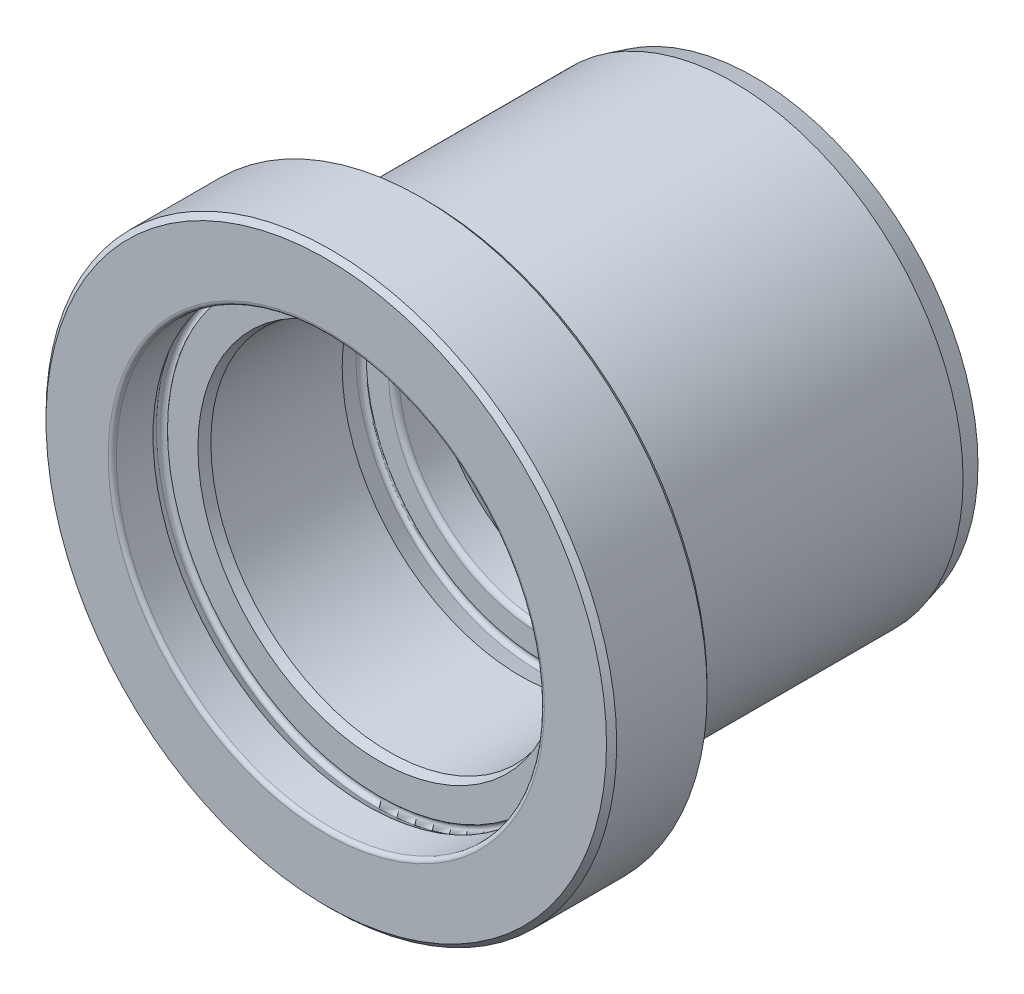
ISO-10303-21;
HEADER;
FILE_DESCRIPTION(('STEP AP214'),'2;1');
FILE_NAME('part.step','',(''),(''),'','','');
FILE_SCHEMA(('AUTOMOTIVE_DESIGN { 1 0 10303 214 1 1 1 1 }'));
ENDSEC;
DATA;
#1=APPLICATION_CONTEXT('core data for automotive mechanical design processes');
#2=APPLICATION_PROTOCOL_DEFINITION('international standard','automotive_design',2000,#1);
#3=PRODUCT_CONTEXT('',#1,'mechanical');
#4=PRODUCT('Part','Part','',(#3));
#5=PRODUCT_RELATED_PRODUCT_CATEGORY('part','',(#4));
#6=PRODUCT_DEFINITION_FORMATION('','',#4);
#7=PRODUCT_DEFINITION_CONTEXT('part definition',#1,'design');
#8=PRODUCT_DEFINITION('design','',#6,#7);
#9=PRODUCT_DEFINITION_SHAPE('','',#8);
#10=(LENGTH_UNIT() NAMED_UNIT(*) SI_UNIT(.MILLI.,.METRE.));
#11=(NAMED_UNIT(*) PLANE_ANGLE_UNIT() SI_UNIT($,.RADIAN.));
#12=(NAMED_UNIT(*) SI_UNIT($,.STERADIAN.) SOLID_ANGLE_UNIT());
#13=UNCERTAINTY_MEASURE_WITH_UNIT(LENGTH_MEASURE(1.E-05),#10,'distance_accuracy_value','');
#14=(GEOMETRIC_REPRESENTATION_CONTEXT(3) GLOBAL_UNCERTAINTY_ASSIGNED_CONTEXT((#13)) GLOBAL_UNIT_ASSIGNED_CONTEXT((#10,
#11,#12)) REPRESENTATION_CONTEXT('',''));
#15=CARTESIAN_POINT('',(0.,0.,0.));
#16=DIRECTION('',(0.,0.,1.));
#17=DIRECTION('',(1.,0.,0.));
#18=AXIS2_PLACEMENT_3D('',#15,#16,#17);
#19=CARTESIAN_POINT('',(0.,0.,-4.));
#20=DIRECTION('',(0.,0.,-1.));
#21=DIRECTION('',(-1.,0.,0.));
#22=AXIS2_PLACEMENT_3D('',#19,#20,#21);
#23=CONICAL_SURFACE('',#22,21.0025,0.520172419876566);
#24=CARTESIAN_POINT('',(0.,0.,-4.77618809610678));
#25=DIRECTION('',(0.,0.,1.));
#26=DIRECTION('',(1.,0.,0.));
#27=AXIS2_PLACEMENT_3D('',#24,#25,#26);
#28=CIRCLE('',#27,21.4470933979066);
#29=CARTESIAN_POINT('',(21.4470933979066,0.,-4.77618809610678));
#30=VERTEX_POINT('',#29);
#31=EDGE_CURVE('E133',#30,#30,#28,.T.);
#32=ORIENTED_EDGE('',*,*,#31,.F.);
#33=EDGE_LOOP('',(#32));
#34=FACE_BOUND('',#33,.T.);
#35=CARTESIAN_POINT('',(0.,0.,-4.));
#36=DIRECTION('',(0.,0.,1.));
#37=DIRECTION('',(1.,0.,0.));
#38=AXIS2_PLACEMENT_3D('',#35,#36,#37);
#39=CIRCLE('',#38,21.0025);
#40=CARTESIAN_POINT('',(21.0025,0.,-4.));
#41=VERTEX_POINT('',#40);
#42=EDGE_CURVE('E10',#41,#41,#39,.T.);
#43=ORIENTED_EDGE('',*,*,#42,.T.);
#44=EDGE_LOOP('',(#43));
#45=FACE_BOUND('',#44,.T.);
#46=ADVANCED_FACE('F39',(#34,#45),#23,.F.);
#47=CARTESIAN_POINT('',(0.,0.,0.));
#48=DIRECTION('',(0.,0.,1.));
#49=DIRECTION('',(1.,0.,0.));
#50=AXIS2_PLACEMENT_3D('',#47,#48,#49);
#51=CYLINDRICAL_SURFACE('',#50,21.0025);
#52=ORIENTED_EDGE('',*,*,#42,.F.);
#53=EDGE_LOOP('',(#52));
#54=FACE_BOUND('',#53,.T.);
#55=CARTESIAN_POINT('',(0.,0.,-0.400000000000004));
#56=DIRECTION('',(0.,0.,1.));
#57=DIRECTION('',(1.,0.,0.));
#58=AXIS2_PLACEMENT_3D('',#55,#56,#57);
#59=CIRCLE('',#58,21.0025);
#60=CARTESIAN_POINT('',(21.0025,0.,-0.400000000000004));
#61=VERTEX_POINT('',#60);
#62=EDGE_CURVE('E45',#61,#61,#59,.T.);
#63=ORIENTED_EDGE('',*,*,#62,.T.);
#64=EDGE_LOOP('',(#63));
#65=FACE_BOUND('',#64,.T.);
#66=ADVANCED_FACE('F140',(#54,#65),#51,.F.);
#67=CARTESIAN_POINT('',(0.,0.,-0.400000000000001));
#68=DIRECTION('',(0.,0.,1.));
#69=DIRECTION('',(1.,0.,0.));
#70=AXIS2_PLACEMENT_3D('',#67,#68,#69);
#71=TOROIDAL_SURFACE('',#70,21.4025,0.400000000000001);
#72=ORIENTED_EDGE('',*,*,#62,.F.);
#73=EDGE_LOOP('',(#72));
#74=FACE_BOUND('',#73,.T.);
#75=CARTESIAN_POINT('',(0.,0.,0.));
#76=DIRECTION('',(0.,0.,1.));
#77=DIRECTION('',(1.,0.,0.));
#78=AXIS2_PLACEMENT_3D('',#75,#76,#77);
#79=CIRCLE('',#78,21.4025);
#80=CARTESIAN_POINT('',(21.4025,0.,0.));
#81=VERTEX_POINT('',#80);
#82=EDGE_CURVE('E49',#81,#81,#79,.T.);
#83=ORIENTED_EDGE('',*,*,#82,.T.);
#84=EDGE_LOOP('',(#83));
#85=FACE_BOUND('',#84,.T.);
#86=ADVANCED_FACE('F144',(#74,#85),#71,.T.);
#87=CARTESIAN_POINT('',(0.,27.5025,0.));
#88=DIRECTION('',(0.,0.,-1.));
#89=DIRECTION('',(-1.,0.,0.));
#90=AXIS2_PLACEMENT_3D('',#87,#88,#89);
#91=PLANE('',#90);
#92=ORIENTED_EDGE('',*,*,#82,.F.);
#93=EDGE_LOOP('',(#92));
#94=FACE_BOUND('',#93,.T.);
#95=CARTESIAN_POINT('',(0.,0.,0.));
#96=DIRECTION('',(0.,0.,1.));
#97=DIRECTION('',(1.,0.,0.));
#98=AXIS2_PLACEMENT_3D('',#95,#96,#97);
#99=CIRCLE('',#98,27.5025);
#100=CARTESIAN_POINT('',(27.5025,0.,0.));
#101=VERTEX_POINT('',#100);
#102=EDGE_CURVE('E53',#101,#101,#99,.T.);
#103=ORIENTED_EDGE('',*,*,#102,.T.);
#104=EDGE_LOOP('',(#103));
#105=FACE_BOUND('',#104,.T.);
#106=ADVANCED_FACE('F149',(#94,#105),#91,.F.);
#107=CARTESIAN_POINT('',(0.,0.,-0.5));
#108=DIRECTION('',(0.,0.,-1.));
#109=DIRECTION('',(-1.,0.,0.));
#110=AXIS2_PLACEMENT_3D('',#107,#108,#109);
#111=CONICAL_SURFACE('',#110,28.0025,0.785398163397449);
#112=ORIENTED_EDGE('',*,*,#102,.F.);
#113=EDGE_LOOP('',(#112));
#114=FACE_BOUND('',#113,.T.);
#115=CARTESIAN_POINT('',(0.,0.,-0.5));
#116=DIRECTION('',(0.,0.,1.));
#117=DIRECTION('',(1.,0.,0.));
#118=AXIS2_PLACEMENT_3D('',#115,#116,#117);
#119=CIRCLE('',#118,28.0025);
#120=CARTESIAN_POINT('',(28.0025,0.,-0.5));
#121=VERTEX_POINT('',#120);
#122=EDGE_CURVE('E58',#121,#121,#119,.T.);
#123=ORIENTED_EDGE('',*,*,#122,.T.);
#124=EDGE_LOOP('',(#123));
#125=FACE_BOUND('',#124,.T.);
#126=ADVANCED_FACE('F155',(#114,#125),#111,.T.);
#127=CARTESIAN_POINT('',(0.,0.,0.));
#128=DIRECTION('',(0.,0.,1.));
#129=DIRECTION('',(1.,0.,0.));
#130=AXIS2_PLACEMENT_3D('',#127,#128,#129);
#131=CYLINDRICAL_SURFACE('',#130,28.0025);
#132=ORIENTED_EDGE('',*,*,#122,.F.);
#133=EDGE_LOOP('',(#132));
#134=FACE_BOUND('',#133,.T.);
#135=CARTESIAN_POINT('',(0.,0.,-9.375));
#136=DIRECTION('',(0.,0.,1.));
#137=DIRECTION('',(1.,0.,0.));
#138=AXIS2_PLACEMENT_3D('',#135,#136,#137);
#139=CIRCLE('',#138,28.0025);
#140=CARTESIAN_POINT('',(28.0025,0.,-9.375));
#141=VERTEX_POINT('',#140);
#142=EDGE_CURVE('E61',#141,#141,#139,.T.);
#143=ORIENTED_EDGE('',*,*,#142,.T.);
#144=EDGE_LOOP('',(#143));
#145=FACE_BOUND('',#144,.T.);
#146=ADVANCED_FACE('F159',(#134,#145),#131,.T.);
#147=CARTESIAN_POINT('',(0.,0.,-9.875));
#148=DIRECTION('',(0.,0.,1.));
#149=DIRECTION('',(1.,0.,0.));
#150=AXIS2_PLACEMENT_3D('',#147,#148,#149);
#151=CONICAL_SURFACE('',#150,27.5025,0.785398163397448);
#152=ORIENTED_EDGE('',*,*,#142,.F.);
#153=EDGE_LOOP('',(#152));
#154=FACE_BOUND('',#153,.T.);
#155=CARTESIAN_POINT('',(0.,0.,-9.875));
#156=DIRECTION('',(0.,0.,1.));
#157=DIRECTION('',(1.,0.,0.));
#158=AXIS2_PLACEMENT_3D('',#155,#156,#157);
#159=CIRCLE('',#158,27.5025);
#160=CARTESIAN_POINT('',(27.5025,0.,-9.875));
#161=VERTEX_POINT('',#160);
#162=EDGE_CURVE('E64',#161,#161,#159,.T.);
#163=ORIENTED_EDGE('',*,*,#162,.T.);
#164=EDGE_LOOP('',(#163));
#165=FACE_BOUND('',#164,.T.);
#166=ADVANCED_FACE('F163',(#154,#165),#151,.T.);
#167=CARTESIAN_POINT('',(0.,22.7872983346207,-9.875));
#168=DIRECTION('',(0.,0.,1.));
#169=DIRECTION('',(1.,0.,0.));
#170=AXIS2_PLACEMENT_3D('',#167,#168,#169);
#171=PLANE('',#170);
#172=ORIENTED_EDGE('',*,*,#162,.F.);
#173=EDGE_LOOP('',(#172));
#174=FACE_BOUND('',#173,.T.);
#175=CARTESIAN_POINT('',(0.,0.,-9.875));
#176=DIRECTION('',(0.,0.,1.));
#177=DIRECTION('',(1.,0.,0.));
#178=AXIS2_PLACEMENT_3D('',#175,#176,#177);
#179=CIRCLE('',#178,22.7872983346207);
#180=CARTESIAN_POINT('',(22.7872983346207,0.,-9.875));
#181=VERTEX_POINT('',#180);
#182=EDGE_CURVE('E67',#181,#181,#179,.T.);
#183=ORIENTED_EDGE('',*,*,#182,.T.);
#184=EDGE_LOOP('',(#183));
#185=FACE_BOUND('',#184,.T.);
#186=ADVANCED_FACE('F167',(#174,#185),#171,.F.);
#187=CARTESIAN_POINT('',(0.,0.,-9.975));
#188=DIRECTION('',(0.,0.,1.));
#189=DIRECTION('',(1.,0.,0.));
#190=AXIS2_PLACEMENT_3D('',#187,#188,#189);
#191=TOROIDAL_SURFACE('',#190,22.4,0.399999999999999);
#192=ORIENTED_EDGE('',*,*,#182,.F.);
#193=EDGE_LOOP('',(#192));
#194=FACE_BOUND('',#193,.T.);
#195=CARTESIAN_POINT('',(0.,0.,-10.078527618041));
#196=DIRECTION('',(0.,0.,1.));
#197=DIRECTION('',(1.,0.,0.));
#198=AXIS2_PLACEMENT_3D('',#195,#196,#197);
#199=CIRCLE('',#198,22.0136296694844);
#200=CARTESIAN_POINT('',(22.0136296694844,0.,-10.078527618041));
#201=VERTEX_POINT('',#200);
#202=EDGE_CURVE('E70',#201,#201,#199,.T.);
#203=ORIENTED_EDGE('',*,*,#202,.T.);
#204=EDGE_LOOP('',(#203));
#205=FACE_BOUND('',#204,.T.);
#206=ADVANCED_FACE('F171',(#194,#205),#191,.F.);
#207=CARTESIAN_POINT('',(0.,0.,-11.9030165298383));
#208=DIRECTION('',(0.,0.,-1.));
#209=DIRECTION('',(-1.,0.,0.));
#210=AXIS2_PLACEMENT_3D('',#207,#208,#209);
#211=CONICAL_SURFACE('',#210,22.5025,0.261799387799149);
#212=ORIENTED_EDGE('',*,*,#202,.F.);
#213=EDGE_LOOP('',(#212));
#214=FACE_BOUND('',#213,.T.);
#215=CARTESIAN_POINT('',(0.,0.,-11.9030165298383));
#216=DIRECTION('',(0.,0.,1.));
#217=DIRECTION('',(1.,0.,0.));
#218=AXIS2_PLACEMENT_3D('',#215,#216,#217);
#219=CIRCLE('',#218,22.5025);
#220=CARTESIAN_POINT('',(22.5025,0.,-11.9030165298383));
#221=VERTEX_POINT('',#220);
#222=EDGE_CURVE('E73',#221,#221,#219,.T.);
#223=ORIENTED_EDGE('',*,*,#222,.T.);
#224=EDGE_LOOP('',(#223));
#225=FACE_BOUND('',#224,.T.);
#226=ADVANCED_FACE('F175',(#214,#225),#211,.T.);
#227=CARTESIAN_POINT('',(0.,0.,0.));
#228=DIRECTION('',(0.,0.,1.));
#229=DIRECTION('',(1.,0.,0.));
#230=AXIS2_PLACEMENT_3D('',#227,#228,#229);
#231=CYLINDRICAL_SURFACE('',#230,22.5025);
#232=ORIENTED_EDGE('',*,*,#222,.F.);
#233=EDGE_LOOP('',(#232));
#234=FACE_BOUND('',#233,.T.);
#235=CARTESIAN_POINT('',(0.,0.,-39.99));
#236=DIRECTION('',(0.,0.,1.));
#237=DIRECTION('',(1.,0.,0.));
#238=AXIS2_PLACEMENT_3D('',#235,#236,#237);
#239=CIRCLE('',#238,22.5025);
#240=CARTESIAN_POINT('',(22.5025,0.,-39.99));
#241=VERTEX_POINT('',#240);
#242=EDGE_CURVE('E76',#241,#241,#239,.T.);
#243=ORIENTED_EDGE('',*,*,#242,.T.);
#244=EDGE_LOOP('',(#243));
#245=FACE_BOUND('',#244,.T.);
#246=ADVANCED_FACE('F179',(#234,#245),#231,.T.);
#247=CARTESIAN_POINT('',(0.,0.,-41.99));
#248=DIRECTION('',(0.,0.,1.));
#249=DIRECTION('',(1.,0.,0.));
#250=AXIS2_PLACEMENT_3D('',#247,#248,#249);
#251=CONICAL_SURFACE('',#250,21.9666016151378,0.261799387799151);
#252=ORIENTED_EDGE('',*,*,#242,.F.);
#253=EDGE_LOOP('',(#252));
#254=FACE_BOUND('',#253,.T.);
#255=CARTESIAN_POINT('',(0.,0.,-41.99));
#256=DIRECTION('',(0.,0.,1.));
#257=DIRECTION('',(1.,0.,0.));
#258=AXIS2_PLACEMENT_3D('',#255,#256,#257);
#259=CIRCLE('',#258,21.9666016151378);
#260=CARTESIAN_POINT('',(21.9666016151378,0.,-41.99));
#261=VERTEX_POINT('',#260);
#262=EDGE_CURVE('E79',#261,#261,#259,.T.);
#263=ORIENTED_EDGE('',*,*,#262,.T.);
#264=EDGE_LOOP('',(#263));
#265=FACE_BOUND('',#264,.T.);
#266=ADVANCED_FACE('F183',(#254,#265),#251,.T.);
#267=CARTESIAN_POINT('',(0.,19.3375,-41.99));
#268=DIRECTION('',(0.,0.,1.));
#269=DIRECTION('',(1.,0.,0.));
#270=AXIS2_PLACEMENT_3D('',#267,#268,#269);
#271=PLANE('',#270);
#272=ORIENTED_EDGE('',*,*,#262,.F.);
#273=EDGE_LOOP('',(#272));
#274=FACE_BOUND('',#273,.T.);
#275=CARTESIAN_POINT('',(0.,0.,-41.99));
#276=DIRECTION('',(0.,0.,1.));
#277=DIRECTION('',(1.,0.,0.));
#278=AXIS2_PLACEMENT_3D('',#275,#276,#277);
#279=CIRCLE('',#278,19.3375);
#280=CARTESIAN_POINT('',(19.3375,0.,-41.99));
#281=VERTEX_POINT('',#280);
#282=EDGE_CURVE('E82',#281,#281,#279,.T.);
#283=ORIENTED_EDGE('',*,*,#282,.T.);
#284=EDGE_LOOP('',(#283));
#285=FACE_BOUND('',#284,.T.);
#286=ADVANCED_FACE('F187',(#274,#285),#271,.F.);
#287=CARTESIAN_POINT('',(0.,0.,-41.69));
#288=DIRECTION('',(0.,0.,1.));
#289=DIRECTION('',(1.,0.,0.));
#290=AXIS2_PLACEMENT_3D('',#287,#288,#289);
#291=TOROIDAL_SURFACE('',#290,19.3375,0.300000000000002);
#292=ORIENTED_EDGE('',*,*,#282,.F.);
#293=EDGE_LOOP('',(#292));
#294=FACE_BOUND('',#293,.T.);
#295=CARTESIAN_POINT('',(0.,0.,-41.69));
#296=DIRECTION('',(0.,0.,1.));
#297=DIRECTION('',(1.,0.,0.));
#298=AXIS2_PLACEMENT_3D('',#295,#296,#297);
#299=CIRCLE('',#298,19.0375);
#300=CARTESIAN_POINT('',(19.0375,0.,-41.69));
#301=VERTEX_POINT('',#300);
#302=EDGE_CURVE('E85',#301,#301,#299,.T.);
#303=ORIENTED_EDGE('',*,*,#302,.T.);
#304=EDGE_LOOP('',(#303));
#305=FACE_BOUND('',#304,.T.);
#306=ADVANCED_FACE('F191',(#294,#305),#291,.T.);
#307=CARTESIAN_POINT('',(0.,0.,0.));
#308=DIRECTION('',(0.,0.,1.));
#309=DIRECTION('',(1.,0.,0.));
#310=AXIS2_PLACEMENT_3D('',#307,#308,#309);
#311=CYLINDRICAL_SURFACE('',#310,19.0375);
#312=ORIENTED_EDGE('',*,*,#302,.F.);
#313=EDGE_LOOP('',(#312));
#314=FACE_BOUND('',#313,.T.);
#315=CARTESIAN_POINT('',(0.,0.,-39.44));
#316=DIRECTION('',(0.,0.,1.));
#317=DIRECTION('',(1.,0.,0.));
#318=AXIS2_PLACEMENT_3D('',#315,#316,#317);
#319=CIRCLE('',#318,19.0375);
#320=CARTESIAN_POINT('',(19.0375,0.,-39.44));
#321=VERTEX_POINT('',#320);
#322=EDGE_CURVE('E88',#321,#321,#319,.T.);
#323=ORIENTED_EDGE('',*,*,#322,.T.);
#324=EDGE_LOOP('',(#323));
#325=FACE_BOUND('',#324,.T.);
#326=ADVANCED_FACE('F195',(#314,#325),#311,.F.);
#327=CARTESIAN_POINT('',(0.,0.,-39.44));
#328=DIRECTION('',(0.,0.,1.));
#329=DIRECTION('',(1.,0.,0.));
#330=AXIS2_PLACEMENT_3D('',#327,#328,#329);
#331=TOROIDAL_SURFACE('',#330,18.5375,0.5);
#332=ORIENTED_EDGE('',*,*,#322,.F.);
#333=EDGE_LOOP('',(#332));
#334=FACE_BOUND('',#333,.T.);
#335=CARTESIAN_POINT('',(0.,0.,-38.94));
#336=DIRECTION('',(0.,0.,1.));
#337=DIRECTION('',(1.,0.,0.));
#338=AXIS2_PLACEMENT_3D('',#335,#336,#337);
#339=CIRCLE('',#338,18.5375);
#340=CARTESIAN_POINT('',(18.5375,0.,-38.94));
#341=VERTEX_POINT('',#340);
#342=EDGE_CURVE('E91',#341,#341,#339,.T.);
#343=ORIENTED_EDGE('',*,*,#342,.T.);
#344=EDGE_LOOP('',(#343));
#345=FACE_BOUND('',#344,.T.);
#346=ADVANCED_FACE('F199',(#334,#345),#331,.F.);
#347=CARTESIAN_POINT('',(0.,18.5375,-38.94));
#348=DIRECTION('',(0.,0.,1.));
#349=DIRECTION('',(1.,0.,0.));
#350=AXIS2_PLACEMENT_3D('',#347,#348,#349);
#351=PLANE('',#350);
#352=ORIENTED_EDGE('',*,*,#342,.F.);
#353=EDGE_LOOP('',(#352));
#354=FACE_BOUND('',#353,.T.);
#355=CARTESIAN_POINT('',(0.,0.,-38.94));
#356=DIRECTION('',(0.,0.,1.));
#357=DIRECTION('',(1.,0.,0.));
#358=AXIS2_PLACEMENT_3D('',#355,#356,#357);
#359=CIRCLE('',#358,17.5);
#360=CARTESIAN_POINT('',(17.5,0.,-38.94));
#361=VERTEX_POINT('',#360);
#362=EDGE_CURVE('E94',#361,#361,#359,.T.);
#363=ORIENTED_EDGE('',*,*,#362,.T.);
#364=EDGE_LOOP('',(#363));
#365=FACE_BOUND('',#364,.T.);
#366=ADVANCED_FACE('F203',(#354,#365),#351,.F.);
#367=CARTESIAN_POINT('',(0.,0.,-37.0475));
#368=DIRECTION('',(0.,0.,-1.));
#369=DIRECTION('',(-1.,0.,0.));
#370=AXIS2_PLACEMENT_3D('',#367,#368,#369);
#371=CONICAL_SURFACE('',#370,15.6075,0.785398163397449);
#372=ORIENTED_EDGE('',*,*,#362,.F.);
#373=EDGE_LOOP('',(#372));
#374=FACE_BOUND('',#373,.T.);
#375=CARTESIAN_POINT('',(0.,0.,-37.0475));
#376=DIRECTION('',(0.,0.,1.));
#377=DIRECTION('',(1.,0.,0.));
#378=AXIS2_PLACEMENT_3D('',#375,#376,#377);
#379=CIRCLE('',#378,15.6075);
#380=CARTESIAN_POINT('',(15.6075,0.,-37.0475));
#381=VERTEX_POINT('',#380);
#382=EDGE_CURVE('E97',#381,#381,#379,.T.);
#383=ORIENTED_EDGE('',*,*,#382,.T.);
#384=EDGE_LOOP('',(#383));
#385=FACE_BOUND('',#384,.T.);
#386=ADVANCED_FACE('F207',(#374,#385),#371,.F.);
#387=CARTESIAN_POINT('',(0.,0.,0.));
#388=DIRECTION('',(0.,0.,1.));
#389=DIRECTION('',(1.,0.,0.));
#390=AXIS2_PLACEMENT_3D('',#387,#388,#389);
#391=CYLINDRICAL_SURFACE('',#390,15.6075);
#392=ORIENTED_EDGE('',*,*,#382,.F.);
#393=EDGE_LOOP('',(#392));
#394=FACE_BOUND('',#393,.T.);
#395=CARTESIAN_POINT('',(0.,0.,-28.49));
#396=DIRECTION('',(0.,0.,1.));
#397=DIRECTION('',(1.,0.,0.));
#398=AXIS2_PLACEMENT_3D('',#395,#396,#397);
#399=CIRCLE('',#398,15.6075);
#400=CARTESIAN_POINT('',(15.6075,0.,-28.49));
#401=VERTEX_POINT('',#400);
#402=EDGE_CURVE('E100',#401,#401,#399,.T.);
#403=ORIENTED_EDGE('',*,*,#402,.T.);
#404=EDGE_LOOP('',(#403));
#405=FACE_BOUND('',#404,.T.);
#406=ADVANCED_FACE('F211',(#394,#405),#391,.F.);
#407=CARTESIAN_POINT('',(0.,0.,-27.4783460324795));
#408=DIRECTION('',(0.,0.,1.));
#409=DIRECTION('',(1.,0.,0.));
#410=AXIS2_PLACEMENT_3D('',#407,#408,#409);
#411=TOROIDAL_SURFACE('',#410,14.5,1.5);
#412=ORIENTED_EDGE('',*,*,#402,.F.);
#413=EDGE_LOOP('',(#412));
#414=FACE_BOUND('',#413,.T.);
#415=CARTESIAN_POINT('',(0.,0.,-26.6198555186182));
#416=DIRECTION('',(0.,0.,1.));
#417=DIRECTION('',(1.,0.,0.));
#418=AXIS2_PLACEMENT_3D('',#415,#416,#417);
#419=CIRCLE('',#418,15.7300382260768);
#420=CARTESIAN_POINT('',(15.7300382260768,0.,-26.6198555186182));
#421=VERTEX_POINT('',#420);
#422=EDGE_CURVE('E103',#421,#421,#419,.T.);
#423=ORIENTED_EDGE('',*,*,#422,.T.);
#424=EDGE_LOOP('',(#423));
#425=FACE_BOUND('',#424,.T.);
#426=ADVANCED_FACE('F215',(#414,#425),#411,.F.);
#427=CARTESIAN_POINT('',(0.,0.,-24.99));
#428=DIRECTION('',(0.,0.,-1.));
#429=DIRECTION('',(-1.,0.,0.));
#430=AXIS2_PLACEMENT_3D('',#427,#428,#429);
#431=CONICAL_SURFACE('',#430,14.5925,0.609340782369836);
#432=ORIENTED_EDGE('',*,*,#422,.F.);
#433=EDGE_LOOP('',(#432));
#434=FACE_BOUND('',#433,.T.);
#435=CARTESIAN_POINT('',(0.,0.,-24.99));
#436=DIRECTION('',(0.,0.,1.));
#437=DIRECTION('',(1.,0.,0.));
#438=AXIS2_PLACEMENT_3D('',#435,#436,#437);
#439=CIRCLE('',#438,14.5925);
#440=CARTESIAN_POINT('',(14.5925,0.,-24.99));
#441=VERTEX_POINT('',#440);
#442=EDGE_CURVE('E106',#441,#441,#439,.T.);
#443=ORIENTED_EDGE('',*,*,#442,.T.);
#444=EDGE_LOOP('',(#443));
#445=FACE_BOUND('',#444,.T.);
#446=ADVANCED_FACE('F219',(#434,#445),#431,.F.);
#447=CARTESIAN_POINT('',(0.,0.,0.));
#448=DIRECTION('',(0.,0.,1.));
#449=DIRECTION('',(1.,0.,0.));
#450=AXIS2_PLACEMENT_3D('',#447,#448,#449);
#451=CYLINDRICAL_SURFACE('',#450,14.5925);
#452=ORIENTED_EDGE('',*,*,#442,.F.);
#453=EDGE_LOOP('',(#452));
#454=FACE_BOUND('',#453,.T.);
#455=CARTESIAN_POINT('',(0.,0.,-21.675));
#456=DIRECTION('',(0.,0.,1.));
#457=DIRECTION('',(1.,0.,0.));
#458=AXIS2_PLACEMENT_3D('',#455,#456,#457);
#459=CIRCLE('',#458,14.5925);
#460=CARTESIAN_POINT('',(14.5925,0.,-21.675));
#461=VERTEX_POINT('',#460);
#462=EDGE_CURVE('E109',#461,#461,#459,.T.);
#463=ORIENTED_EDGE('',*,*,#462,.T.);
#464=EDGE_LOOP('',(#463));
#465=FACE_BOUND('',#464,.T.);
#466=ADVANCED_FACE('F223',(#454,#465),#451,.F.);
#467=CARTESIAN_POINT('',(0.,0.,-21.675));
#468=DIRECTION('',(0.,0.,1.));
#469=DIRECTION('',(1.,0.,0.));
#470=AXIS2_PLACEMENT_3D('',#467,#468,#469);
#471=TOROIDAL_SURFACE('',#470,15.0925,0.5);
#472=ORIENTED_EDGE('',*,*,#462,.F.);
#473=EDGE_LOOP('',(#472));
#474=FACE_BOUND('',#473,.T.);
#475=CARTESIAN_POINT('',(0.,0.,-21.175));
#476=DIRECTION('',(0.,0.,1.));
#477=DIRECTION('',(1.,0.,0.));
#478=AXIS2_PLACEMENT_3D('',#475,#476,#477);
#479=CIRCLE('',#478,15.0925);
#480=CARTESIAN_POINT('',(15.0925,0.,-21.175));
#481=VERTEX_POINT('',#480);
#482=EDGE_CURVE('E112',#481,#481,#479,.T.);
#483=ORIENTED_EDGE('',*,*,#482,.T.);
#484=EDGE_LOOP('',(#483));
#485=FACE_BOUND('',#484,.T.);
#486=ADVANCED_FACE('F227',(#474,#485),#471,.T.);
#487=CARTESIAN_POINT('',(0.,17.2535898384862,-21.175));
#488=DIRECTION('',(0.,0.,-1.));
#489=DIRECTION('',(-1.,0.,0.));
#490=AXIS2_PLACEMENT_3D('',#487,#488,#489);
#491=PLANE('',#490);
#492=ORIENTED_EDGE('',*,*,#482,.F.);
#493=EDGE_LOOP('',(#492));
#494=FACE_BOUND('',#493,.T.);
#495=CARTESIAN_POINT('',(0.,0.,-21.175));
#496=DIRECTION('',(0.,0.,1.));
#497=DIRECTION('',(1.,0.,0.));
#498=AXIS2_PLACEMENT_3D('',#495,#496,#497);
#499=CIRCLE('',#498,17.2535898384862);
#500=CARTESIAN_POINT('',(17.2535898384862,0.,-21.175));
#501=VERTEX_POINT('',#500);
#502=EDGE_CURVE('E115',#501,#501,#499,.T.);
#503=ORIENTED_EDGE('',*,*,#502,.T.);
#504=EDGE_LOOP('',(#503));
#505=FACE_BOUND('',#504,.T.);
#506=ADVANCED_FACE('F231',(#494,#505),#491,.F.);
#507=CARTESIAN_POINT('',(0.,0.,-20.975));
#508=DIRECTION('',(0.,0.,1.));
#509=DIRECTION('',(1.,0.,0.));
#510=AXIS2_PLACEMENT_3D('',#507,#508,#509);
#511=TOROIDAL_SURFACE('',#510,17.6,0.399999999999999);
#512=ORIENTED_EDGE('',*,*,#502,.F.);
#513=EDGE_LOOP('',(#512));
#514=FACE_BOUND('',#513,.T.);
#515=CARTESIAN_POINT('',(0.,0.,-20.871472381959));
#516=DIRECTION('',(0.,0.,1.));
#517=DIRECTION('',(1.,0.,0.));
#518=AXIS2_PLACEMENT_3D('',#515,#516,#517);
#519=CIRCLE('',#518,17.9863703305156);
#520=CARTESIAN_POINT('',(17.9863703305156,0.,-20.871472381959));
#521=VERTEX_POINT('',#520);
#522=EDGE_CURVE('E118',#521,#521,#519,.T.);
#523=ORIENTED_EDGE('',*,*,#522,.T.);
#524=EDGE_LOOP('',(#523));
#525=FACE_BOUND('',#524,.T.);
#526=ADVANCED_FACE('F235',(#514,#525),#511,.F.);
#527=CARTESIAN_POINT('',(0.,0.,-19.0656437241996));
#528=DIRECTION('',(0.,0.,-1.));
#529=DIRECTION('',(-1.,0.,0.));
#530=AXIS2_PLACEMENT_3D('',#527,#528,#529);
#531=CONICAL_SURFACE('',#530,17.5025,0.26179938779915);
#532=ORIENTED_EDGE('',*,*,#522,.F.);
#533=EDGE_LOOP('',(#532));
#534=FACE_BOUND('',#533,.T.);
#535=CARTESIAN_POINT('',(0.,0.,-19.0656437241996));
#536=DIRECTION('',(0.,0.,1.));
#537=DIRECTION('',(1.,0.,0.));
#538=AXIS2_PLACEMENT_3D('',#535,#536,#537);
#539=CIRCLE('',#538,17.5025);
#540=CARTESIAN_POINT('',(17.5025,0.,-19.0656437241996));
#541=VERTEX_POINT('',#540);
#542=EDGE_CURVE('E121',#541,#541,#539,.T.);
#543=ORIENTED_EDGE('',*,*,#542,.T.);
#544=EDGE_LOOP('',(#543));
#545=FACE_BOUND('',#544,.T.);
#546=ADVANCED_FACE('F239',(#534,#545),#531,.F.);
#547=CARTESIAN_POINT('',(0.,0.,0.));
#548=DIRECTION('',(0.,0.,1.));
#549=DIRECTION('',(1.,0.,0.));
#550=AXIS2_PLACEMENT_3D('',#547,#548,#549);
#551=CYLINDRICAL_SURFACE('',#550,17.5025);
#552=ORIENTED_EDGE('',*,*,#542,.F.);
#553=EDGE_LOOP('',(#552));
#554=FACE_BOUND('',#553,.T.);
#555=CARTESIAN_POINT('',(0.,0.,-6.175));
#556=DIRECTION('',(0.,0.,1.));
#557=DIRECTION('',(1.,0.,0.));
#558=AXIS2_PLACEMENT_3D('',#555,#556,#557);
#559=CIRCLE('',#558,17.5025);
#560=CARTESIAN_POINT('',(17.5025,0.,-6.175));
#561=VERTEX_POINT('',#560);
#562=EDGE_CURVE('E124',#561,#561,#559,.T.);
#563=ORIENTED_EDGE('',*,*,#562,.T.);
#564=EDGE_LOOP('',(#563));
#565=FACE_BOUND('',#564,.T.);
#566=ADVANCED_FACE('F243',(#554,#565),#551,.F.);
#567=CARTESIAN_POINT('',(0.,0.,-5.175));
#568=DIRECTION('',(0.,0.,1.));
#569=DIRECTION('',(1.,0.,0.));
#570=AXIS2_PLACEMENT_3D('',#567,#568,#569);
#571=CONICAL_SURFACE('',#570,17.7704491924311,0.26179938779915);
#572=ORIENTED_EDGE('',*,*,#562,.F.);
#573=EDGE_LOOP('',(#572));
#574=FACE_BOUND('',#573,.T.);
#575=CARTESIAN_POINT('',(0.,0.,-5.175));
#576=DIRECTION('',(0.,0.,1.));
#577=DIRECTION('',(1.,0.,0.));
#578=AXIS2_PLACEMENT_3D('',#575,#576,#577);
#579=CIRCLE('',#578,17.7704491924311);
#580=CARTESIAN_POINT('',(17.7704491924311,0.,-5.175));
#581=VERTEX_POINT('',#580);
#582=EDGE_CURVE('E127',#581,#581,#579,.T.);
#583=ORIENTED_EDGE('',*,*,#582,.T.);
#584=EDGE_LOOP('',(#583));
#585=FACE_BOUND('',#584,.T.);
#586=ADVANCED_FACE('F247',(#574,#585),#571,.F.);
#587=CARTESIAN_POINT('',(0.,20.7535898384862,-5.175));
#588=DIRECTION('',(0.,0.,-1.));
#589=DIRECTION('',(-1.,0.,0.));
#590=AXIS2_PLACEMENT_3D('',#587,#588,#589);
#591=PLANE('',#590);
#592=ORIENTED_EDGE('',*,*,#582,.F.);
#593=EDGE_LOOP('',(#592));
#594=FACE_BOUND('',#593,.T.);
#595=CARTESIAN_POINT('',(0.,0.,-5.175));
#596=DIRECTION('',(0.,0.,1.));
#597=DIRECTION('',(1.,0.,0.));
#598=AXIS2_PLACEMENT_3D('',#595,#596,#597);
#599=CIRCLE('',#598,20.7535898384862);
#600=CARTESIAN_POINT('',(20.7535898384862,0.,-5.175));
#601=VERTEX_POINT('',#600);
#602=EDGE_CURVE('E130',#601,#601,#599,.T.);
#603=ORIENTED_EDGE('',*,*,#602,.T.);
#604=EDGE_LOOP('',(#603));
#605=FACE_BOUND('',#604,.T.);
#606=ADVANCED_FACE('F251',(#594,#605),#591,.F.);
#607=CARTESIAN_POINT('',(0.,0.,-4.975));
#608=DIRECTION('',(0.,0.,1.));
#609=DIRECTION('',(1.,0.,0.));
#610=AXIS2_PLACEMENT_3D('',#607,#608,#609);
#611=TOROIDAL_SURFACE('',#610,21.1,0.4);
#612=ORIENTED_EDGE('',*,*,#602,.F.);
#613=EDGE_LOOP('',(#612));
#614=FACE_BOUND('',#613,.T.);
#615=ORIENTED_EDGE('',*,*,#31,.T.);
#616=EDGE_LOOP('',(#615));
#617=FACE_BOUND('',#616,.T.);
#618=ADVANCED_FACE('F137',(#614,#617),#611,.F.);
#619=CLOSED_SHELL('',(#46,#66,#86,#106,#126,#146,#166,#186,#206,#226,#246,#266,#286,#306,#326,
#346,#366,#386,#406,#426,#446,#466,#486,#506,#526,#546,#566,#586,#606,#618));
#620=MANIFOLD_SOLID_BREP('B2',#619);
#621=ADVANCED_BREP_SHAPE_REPRESENTATION('',(#18,#620),#14);
#622=SHAPE_DEFINITION_REPRESENTATION(#9,#621);
ENDSEC;
END-ISO-10303-21;
